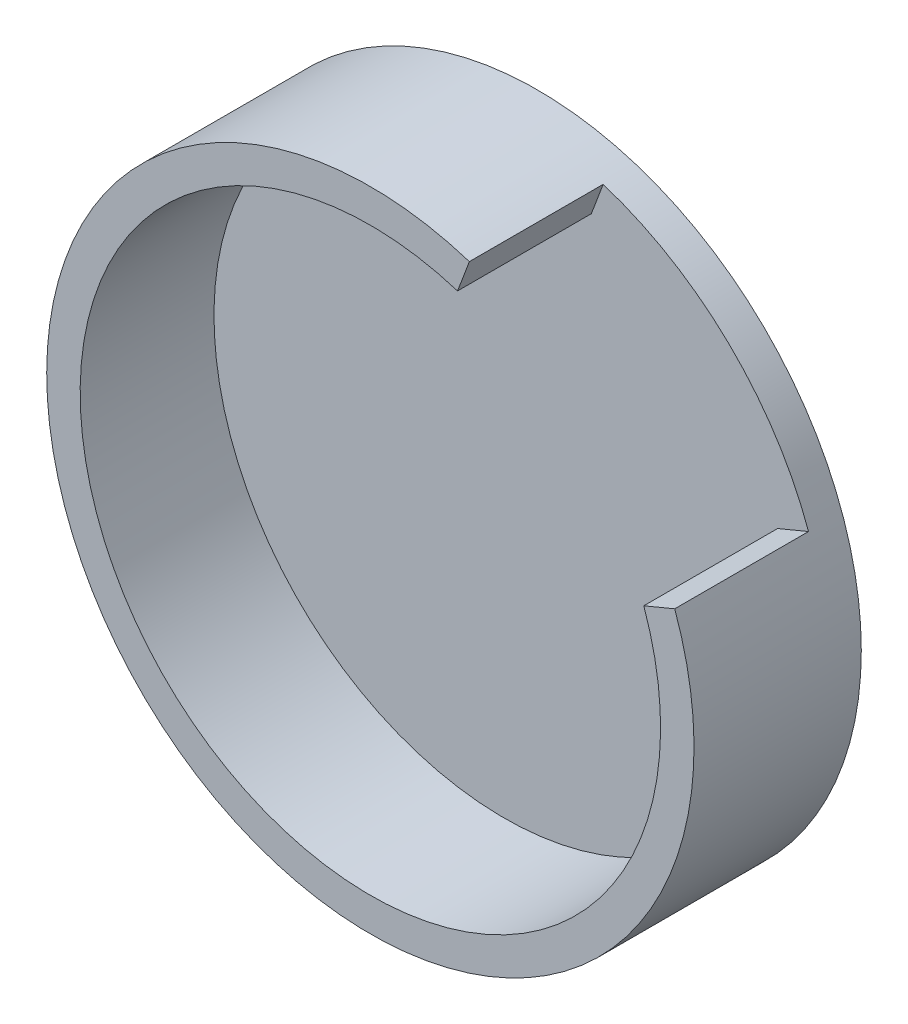
ISO-10303-21;
HEADER;
FILE_DESCRIPTION(('STEP AP214'),'2;1');
FILE_NAME('part.step','',(''),(''),'','','');
FILE_SCHEMA(('AUTOMOTIVE_DESIGN { 1 0 10303 214 1 1 1 1 }'));
ENDSEC;
DATA;
#1=APPLICATION_CONTEXT('core data for automotive mechanical design processes');
#2=APPLICATION_PROTOCOL_DEFINITION('international standard','automotive_design',2000,#1);
#3=PRODUCT_CONTEXT('',#1,'mechanical');
#4=PRODUCT('Part','Part','',(#3));
#5=PRODUCT_RELATED_PRODUCT_CATEGORY('part','',(#4));
#6=PRODUCT_DEFINITION_FORMATION('','',#4);
#7=PRODUCT_DEFINITION_CONTEXT('part definition',#1,'design');
#8=PRODUCT_DEFINITION('design','',#6,#7);
#9=PRODUCT_DEFINITION_SHAPE('','',#8);
#10=(LENGTH_UNIT() NAMED_UNIT(*) SI_UNIT(.MILLI.,.METRE.));
#11=(NAMED_UNIT(*) PLANE_ANGLE_UNIT() SI_UNIT($,.RADIAN.));
#12=(NAMED_UNIT(*) SI_UNIT($,.STERADIAN.) SOLID_ANGLE_UNIT());
#13=UNCERTAINTY_MEASURE_WITH_UNIT(LENGTH_MEASURE(1.E-05),#10,'distance_accuracy_value','');
#14=(GEOMETRIC_REPRESENTATION_CONTEXT(3) GLOBAL_UNCERTAINTY_ASSIGNED_CONTEXT((#13)) GLOBAL_UNIT_ASSIGNED_CONTEXT((#10,
#11,#12)) REPRESENTATION_CONTEXT('',''));
#15=CARTESIAN_POINT('',(0.,0.,0.));
#16=DIRECTION('',(0.,0.,1.));
#17=DIRECTION('',(1.,0.,0.));
#18=AXIS2_PLACEMENT_3D('',#15,#16,#17);
#19=CARTESIAN_POINT('',(0.,0.,10.));
#20=DIRECTION('',(0.,0.,-1.));
#21=DIRECTION('',(-1.,0.,0.));
#22=AXIS2_PLACEMENT_3D('',#19,#20,#21);
#23=CYLINDRICAL_SURFACE('',#22,19.35);
#24=CARTESIAN_POINT('',(0.,0.,2.));
#25=DIRECTION('',(0.,0.,-1.));
#26=DIRECTION('',(-1.,0.,0.));
#27=AXIS2_PLACEMENT_3D('',#24,#25,#26);
#28=CIRCLE('',#27,19.35);
#29=CARTESIAN_POINT('',(5.91867852004155,18.4225878903155,2.));
#30=VERTEX_POINT('',#29);
#31=CARTESIAN_POINT('',(18.1952536787912,6.58446987725186,2.));
#32=VERTEX_POINT('',#31);
#33=EDGE_CURVE('E87',#30,#32,#28,.T.);
#34=ORIENTED_EDGE('',*,*,#33,.T.);
#35=DIRECTION('',(0.,0.,1.));
#36=VECTOR('',#35,1.);
#37=CARTESIAN_POINT('',(18.1952536787912,6.58446987725186,2.));
#38=LINE('',#37,#36);
#39=CARTESIAN_POINT('',(18.1952536787912,6.58446987725186,10.));
#40=VERTEX_POINT('',#39);
#41=EDGE_CURVE('E69',#32,#40,#38,.T.);
#42=ORIENTED_EDGE('',*,*,#41,.T.);
#43=CARTESIAN_POINT('',(0.,0.,10.));
#44=DIRECTION('',(0.,0.,1.));
#45=DIRECTION('',(1.,0.,0.));
#46=AXIS2_PLACEMENT_3D('',#43,#44,#45);
#47=CIRCLE('',#46,19.35);
#48=CARTESIAN_POINT('',(5.91867852004155,18.4225878903155,10.));
#49=VERTEX_POINT('',#48);
#50=EDGE_CURVE('E11',#49,#40,#47,.T.);
#51=ORIENTED_EDGE('',*,*,#50,.F.);
#52=DIRECTION('',(0.,0.,1.));
#53=VECTOR('',#52,1.);
#54=CARTESIAN_POINT('',(5.91867852004155,18.4225878903155,2.));
#55=LINE('',#54,#53);
#56=EDGE_CURVE('E97',#30,#49,#55,.T.);
#57=ORIENTED_EDGE('',*,*,#56,.F.);
#58=EDGE_LOOP('',(#34,#42,#51,#57));
#59=FACE_BOUND('',#58,.T.);
#60=CARTESIAN_POINT('',(0.,0.,0.));
#61=DIRECTION('',(0.,0.,1.));
#62=DIRECTION('',(1.,0.,0.));
#63=AXIS2_PLACEMENT_3D('',#60,#61,#62);
#64=CIRCLE('',#63,19.35);
#65=CARTESIAN_POINT('',(19.35,0.,0.));
#66=VERTEX_POINT('',#65);
#67=EDGE_CURVE('E48',#66,#66,#64,.T.);
#68=ORIENTED_EDGE('',*,*,#67,.T.);
#69=EDGE_LOOP('',(#68));
#70=FACE_BOUND('',#69,.T.);
#71=ADVANCED_FACE('F45',(#59,#70),#23,.T.);
#72=CARTESIAN_POINT('',(0.,0.,10.));
#73=DIRECTION('',(0.,0.,1.));
#74=DIRECTION('',(1.,0.,0.));
#75=AXIS2_PLACEMENT_3D('',#72,#73,#74);
#76=PLANE('',#75);
#77=DIRECTION('',(0.923337753192548,0.383988793494469,0.));
#78=VECTOR('',#77,1.);
#79=CARTESIAN_POINT('',(16.3463110372125,5.81554945595914,10.));
#80=LINE('',#79,#78);
#81=CARTESIAN_POINT('',(16.3463110372125,5.81554945595914,10.));
#82=VERTEX_POINT('',#81);
#83=EDGE_CURVE('E85',#82,#40,#80,.T.);
#84=ORIENTED_EDGE('',*,*,#83,.F.);
#85=CARTESIAN_POINT('',(0.,0.,10.));
#86=DIRECTION('',(0.,0.,1.));
#87=DIRECTION('',(1.,0.,0.));
#88=AXIS2_PLACEMENT_3D('',#85,#86,#87);
#89=CIRCLE('',#88,17.35);
#90=CARTESIAN_POINT('',(5.21208397579609,16.5486156710841,10.));
#91=VERTEX_POINT('',#90);
#92=EDGE_CURVE('E117',#91,#82,#89,.T.);
#93=ORIENTED_EDGE('',*,*,#92,.F.);
#94=DIRECTION('',(-0.352810388905978,-0.935694837797031,0.));
#95=VECTOR('',#94,1.);
#96=CARTESIAN_POINT('',(5.91867852004155,18.4225878903155,10.));
#97=LINE('',#96,#95);
#98=EDGE_CURVE('E190',#49,#91,#97,.T.);
#99=ORIENTED_EDGE('',*,*,#98,.F.);
#100=ORIENTED_EDGE('',*,*,#50,.T.);
#101=EDGE_LOOP('',(#84,#93,#99,#100));
#102=FACE_BOUND('',#101,.T.);
#103=ADVANCED_FACE('F130',(#102),#76,.T.);
#104=CARTESIAN_POINT('',(0.,0.,0.));
#105=DIRECTION('',(0.,0.,1.));
#106=DIRECTION('',(1.,0.,0.));
#107=AXIS2_PLACEMENT_3D('',#104,#105,#106);
#108=PLANE('',#107);
#109=ORIENTED_EDGE('',*,*,#67,.F.);
#110=EDGE_LOOP('',(#109));
#111=FACE_BOUND('',#110,.T.);
#112=ADVANCED_FACE('F127',(#111),#108,.F.);
#113=CARTESIAN_POINT('',(0.,0.,10.));
#114=DIRECTION('',(0.,0.,-1.));
#115=DIRECTION('',(-1.,0.,0.));
#116=AXIS2_PLACEMENT_3D('',#113,#114,#115);
#117=CYLINDRICAL_SURFACE('',#116,17.35);
#118=DIRECTION('',(0.,0.,1.));
#119=VECTOR('',#118,1.);
#120=CARTESIAN_POINT('',(16.3463110372125,5.81554945595914,2.));
#121=LINE('',#120,#119);
#122=CARTESIAN_POINT('',(16.3463110372125,5.81554945595914,2.));
#123=VERTEX_POINT('',#122);
#124=EDGE_CURVE('E110',#123,#82,#121,.T.);
#125=ORIENTED_EDGE('',*,*,#124,.F.);
#126=CARTESIAN_POINT('',(0.,0.,2.));
#127=DIRECTION('',(0.,0.,1.));
#128=DIRECTION('',(1.,0.,0.));
#129=AXIS2_PLACEMENT_3D('',#126,#127,#128);
#130=CIRCLE('',#129,17.35);
#131=CARTESIAN_POINT('',(5.21208397579609,16.5486156710841,2.));
#132=VERTEX_POINT('',#131);
#133=EDGE_CURVE('E93',#132,#123,#130,.T.);
#134=ORIENTED_EDGE('',*,*,#133,.F.);
#135=DIRECTION('',(0.,0.,1.));
#136=VECTOR('',#135,1.);
#137=CARTESIAN_POINT('',(5.21208397579609,16.5486156710841,2.));
#138=LINE('',#137,#136);
#139=EDGE_CURVE('E100',#132,#91,#138,.T.);
#140=ORIENTED_EDGE('',*,*,#139,.T.);
#141=ORIENTED_EDGE('',*,*,#92,.T.);
#142=EDGE_LOOP('',(#125,#134,#140,#141));
#143=FACE_BOUND('',#142,.T.);
#144=ADVANCED_FACE('F129',(#143),#117,.F.);
#145=CARTESIAN_POINT('',(0.,0.,2.));
#146=DIRECTION('',(0.,0.,1.));
#147=DIRECTION('',(1.,0.,0.));
#148=AXIS2_PLACEMENT_3D('',#145,#146,#147);
#149=PLANE('',#148);
#150=ORIENTED_EDGE('',*,*,#133,.T.);
#151=DIRECTION('',(0.923337753192548,0.383988793494469,0.));
#152=VECTOR('',#151,1.);
#153=CARTESIAN_POINT('',(16.3463110372125,5.81554945595914,2.));
#154=LINE('',#153,#152);
#155=EDGE_CURVE('E89',#123,#32,#154,.T.);
#156=ORIENTED_EDGE('',*,*,#155,.T.);
#157=ORIENTED_EDGE('',*,*,#33,.F.);
#158=DIRECTION('',(-0.352810388905978,-0.935694837797031,0.));
#159=VECTOR('',#158,1.);
#160=CARTESIAN_POINT('',(5.91867852004155,18.4225878903155,2.));
#161=LINE('',#160,#159);
#162=EDGE_CURVE('E60',#30,#132,#161,.T.);
#163=ORIENTED_EDGE('',*,*,#162,.T.);
#164=EDGE_LOOP('',(#150,#156,#157,#163));
#165=FACE_BOUND('',#164,.T.);
#166=ADVANCED_FACE('F88',(#165),#149,.T.);
#167=CARTESIAN_POINT('',(16.3463110372125,5.81554945595914,2.));
#168=DIRECTION('',(0.383988793494469,-0.923337753192548,0.));
#169=DIRECTION('',(0.923337753192548,0.383988793494469,0.));
#170=AXIS2_PLACEMENT_3D('',#167,#168,#169);
#171=PLANE('',#170);
#172=ORIENTED_EDGE('',*,*,#83,.T.);
#173=ORIENTED_EDGE('',*,*,#41,.F.);
#174=ORIENTED_EDGE('',*,*,#155,.F.);
#175=ORIENTED_EDGE('',*,*,#124,.T.);
#176=EDGE_LOOP('',(#172,#173,#174,#175));
#177=FACE_BOUND('',#176,.T.);
#178=ADVANCED_FACE('F159',(#177),#171,.F.);
#179=CARTESIAN_POINT('',(5.91867852004155,18.4225878903155,2.));
#180=DIRECTION('',(-0.935694837797031,0.352810388905978,0.));
#181=DIRECTION('',(-0.352810388905978,-0.935694837797031,0.));
#182=AXIS2_PLACEMENT_3D('',#179,#180,#181);
#183=PLANE('',#182);
#184=ORIENTED_EDGE('',*,*,#98,.T.);
#185=ORIENTED_EDGE('',*,*,#139,.F.);
#186=ORIENTED_EDGE('',*,*,#162,.F.);
#187=ORIENTED_EDGE('',*,*,#56,.T.);
#188=EDGE_LOOP('',(#184,#185,#186,#187));
#189=FACE_BOUND('',#188,.T.);
#190=ADVANCED_FACE('F96',(#189),#183,.F.);
#191=CLOSED_SHELL('',(#71,#103,#112,#144,#166,#178,#190));
#192=MANIFOLD_SOLID_BREP('B2',#191);
#193=ADVANCED_BREP_SHAPE_REPRESENTATION('',(#18,#192),#14);
#194=SHAPE_DEFINITION_REPRESENTATION(#9,#193);
ENDSEC;
END-ISO-10303-21;
